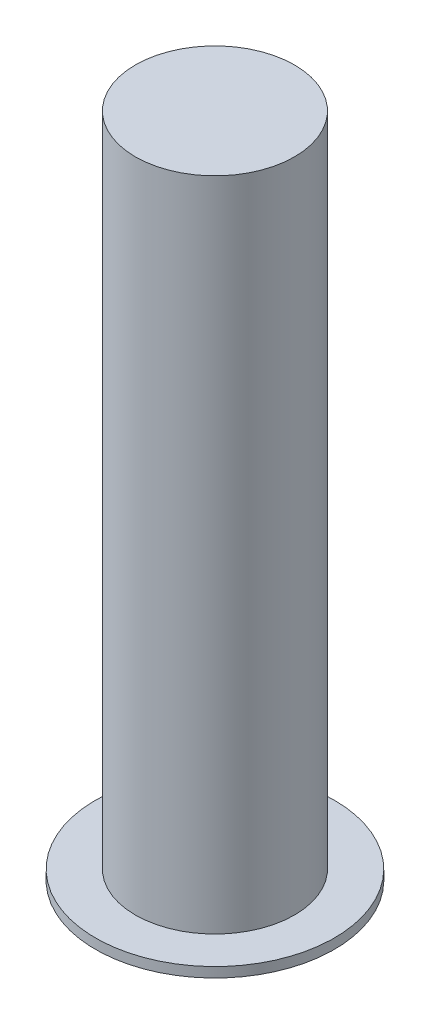
ISO-10303-21;
HEADER;
FILE_DESCRIPTION(('STEP AP214'),'2;1');
FILE_NAME('part.step','',(''),(''),'','','');
FILE_SCHEMA(('AUTOMOTIVE_DESIGN { 1 0 10303 214 1 1 1 1 }'));
ENDSEC;
DATA;
#1=APPLICATION_CONTEXT('core data for automotive mechanical design processes');
#2=APPLICATION_PROTOCOL_DEFINITION('international standard','automotive_design',2000,#1);
#3=PRODUCT_CONTEXT('',#1,'mechanical');
#4=PRODUCT('Part','Part','',(#3));
#5=PRODUCT_RELATED_PRODUCT_CATEGORY('part','',(#4));
#6=PRODUCT_DEFINITION_FORMATION('','',#4);
#7=PRODUCT_DEFINITION_CONTEXT('part definition',#1,'design');
#8=PRODUCT_DEFINITION('design','',#6,#7);
#9=PRODUCT_DEFINITION_SHAPE('','',#8);
#10=(LENGTH_UNIT() NAMED_UNIT(*) SI_UNIT(.MILLI.,.METRE.));
#11=(NAMED_UNIT(*) PLANE_ANGLE_UNIT() SI_UNIT($,.RADIAN.));
#12=(NAMED_UNIT(*) SI_UNIT($,.STERADIAN.) SOLID_ANGLE_UNIT());
#13=UNCERTAINTY_MEASURE_WITH_UNIT(LENGTH_MEASURE(1.E-05),#10,'distance_accuracy_value','');
#14=(GEOMETRIC_REPRESENTATION_CONTEXT(3) GLOBAL_UNCERTAINTY_ASSIGNED_CONTEXT((#13)) GLOBAL_UNIT_ASSIGNED_CONTEXT((#10,
#11,#12)) REPRESENTATION_CONTEXT('',''));
#15=CARTESIAN_POINT('',(0.,0.,0.));
#16=DIRECTION('',(0.,0.,1.));
#17=DIRECTION('',(1.,0.,0.));
#18=AXIS2_PLACEMENT_3D('',#15,#16,#17);
#19=CARTESIAN_POINT('',(0.,33.,0.));
#20=DIRECTION('',(0.,-1.,0.));
#21=DIRECTION('',(0.,0.,-1.));
#22=AXIS2_PLACEMENT_3D('',#19,#20,#21);
#23=CYLINDRICAL_SURFACE('',#22,4.);
#24=CARTESIAN_POINT('',(0.,33.,0.));
#25=DIRECTION('',(0.,1.,0.));
#26=DIRECTION('',(0.,0.,1.));
#27=AXIS2_PLACEMENT_3D('',#24,#25,#26);
#28=CIRCLE('',#27,4.);
#29=CARTESIAN_POINT('',(0.,33.,4.));
#30=VERTEX_POINT('',#29);
#31=EDGE_CURVE('E10',#30,#30,#28,.T.);
#32=ORIENTED_EDGE('',*,*,#31,.F.);
#33=EDGE_LOOP('',(#32));
#34=FACE_BOUND('',#33,.T.);
#35=CARTESIAN_POINT('',(0.,0.,0.));
#36=DIRECTION('',(0.,-1.,0.));
#37=DIRECTION('',(0.,0.,-1.));
#38=AXIS2_PLACEMENT_3D('',#35,#36,#37);
#39=CIRCLE('',#38,4.);
#40=CARTESIAN_POINT('',(0.,0.,-4.));
#41=VERTEX_POINT('',#40);
#42=EDGE_CURVE('E37',#41,#41,#39,.T.);
#43=ORIENTED_EDGE('',*,*,#42,.F.);
#44=EDGE_LOOP('',(#43));
#45=FACE_BOUND('',#44,.T.);
#46=ADVANCED_FACE('F31',(#34,#45),#23,.T.);
#47=CARTESIAN_POINT('',(0.,33.,0.));
#48=DIRECTION('',(0.,1.,0.));
#49=DIRECTION('',(0.,0.,1.));
#50=AXIS2_PLACEMENT_3D('',#47,#48,#49);
#51=PLANE('',#50);
#52=ORIENTED_EDGE('',*,*,#31,.T.);
#53=EDGE_LOOP('',(#52));
#54=FACE_BOUND('',#53,.T.);
#55=ADVANCED_FACE('F55',(#54),#51,.T.);
#56=CARTESIAN_POINT('',(0.,0.,0.));
#57=DIRECTION('',(0.,-1.,0.));
#58=DIRECTION('',(0.,0.,-1.));
#59=AXIS2_PLACEMENT_3D('',#56,#57,#58);
#60=PLANE('',#59);
#61=CARTESIAN_POINT('',(0.,0.,0.));
#62=DIRECTION('',(0.,-1.,0.));
#63=DIRECTION('',(0.,0.,-1.));
#64=AXIS2_PLACEMENT_3D('',#61,#62,#63);
#65=CIRCLE('',#64,6.);
#66=CARTESIAN_POINT('',(0.,0.,-6.));
#67=VERTEX_POINT('',#66);
#68=EDGE_CURVE('E45',#67,#67,#65,.T.);
#69=ORIENTED_EDGE('',*,*,#68,.F.);
#70=EDGE_LOOP('',(#69));
#71=FACE_BOUND('',#70,.T.);
#72=ORIENTED_EDGE('',*,*,#42,.T.);
#73=EDGE_LOOP('',(#72));
#74=FACE_BOUND('',#73,.T.);
#75=ADVANCED_FACE('F53',(#71,#74),#60,.F.);
#76=CARTESIAN_POINT('',(0.,-0.5,0.));
#77=DIRECTION('',(0.,1.,0.));
#78=DIRECTION('',(0.,0.,1.));
#79=AXIS2_PLACEMENT_3D('',#76,#77,#78);
#80=CYLINDRICAL_SURFACE('',#79,6.);
#81=CARTESIAN_POINT('',(0.,-0.5,0.));
#82=DIRECTION('',(0.,-1.,0.));
#83=DIRECTION('',(0.,0.,-1.));
#84=AXIS2_PLACEMENT_3D('',#81,#82,#83);
#85=CIRCLE('',#84,6.);
#86=CARTESIAN_POINT('',(0.,-0.5,-6.));
#87=VERTEX_POINT('',#86);
#88=EDGE_CURVE('E41',#87,#87,#85,.T.);
#89=ORIENTED_EDGE('',*,*,#88,.F.);
#90=EDGE_LOOP('',(#89));
#91=FACE_BOUND('',#90,.T.);
#92=ORIENTED_EDGE('',*,*,#68,.T.);
#93=EDGE_LOOP('',(#92));
#94=FACE_BOUND('',#93,.T.);
#95=ADVANCED_FACE('F51',(#91,#94),#80,.T.);
#96=CARTESIAN_POINT('',(0.,-0.5,0.));
#97=DIRECTION('',(0.,-1.,0.));
#98=DIRECTION('',(0.,0.,-1.));
#99=AXIS2_PLACEMENT_3D('',#96,#97,#98);
#100=PLANE('',#99);
#101=ORIENTED_EDGE('',*,*,#88,.T.);
#102=EDGE_LOOP('',(#101));
#103=FACE_BOUND('',#102,.T.);
#104=ADVANCED_FACE('F61',(#103),#100,.T.);
#105=CLOSED_SHELL('',(#46,#55,#75,#95,#104));
#106=MANIFOLD_SOLID_BREP('B2',#105);
#107=ADVANCED_BREP_SHAPE_REPRESENTATION('',(#18,#106),#14);
#108=SHAPE_DEFINITION_REPRESENTATION(#9,#107);
ENDSEC;
END-ISO-10303-21;
